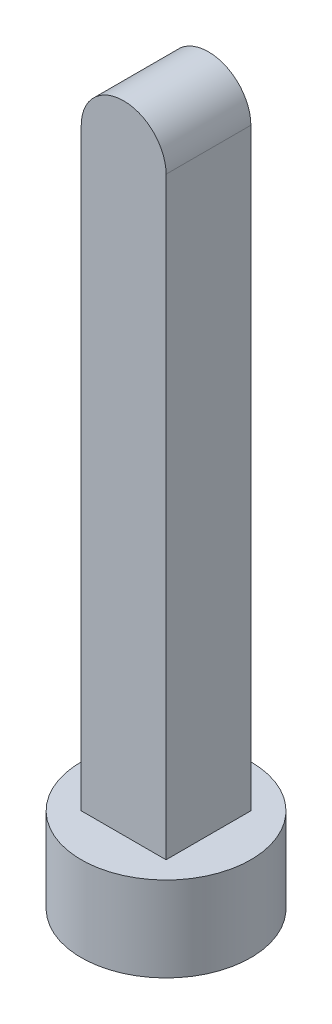
ISO-10303-21;
HEADER;
FILE_DESCRIPTION(('STEP AP214'),'2;1');
FILE_NAME('part.step','',(''),(''),'','','');
FILE_SCHEMA(('AUTOMOTIVE_DESIGN { 1 0 10303 214 1 1 1 1 }'));
ENDSEC;
DATA;
#1=APPLICATION_CONTEXT('core data for automotive mechanical design processes');
#2=APPLICATION_PROTOCOL_DEFINITION('international standard','automotive_design',2000,#1);
#3=PRODUCT_CONTEXT('',#1,'mechanical');
#4=PRODUCT('Part','Part','',(#3));
#5=PRODUCT_RELATED_PRODUCT_CATEGORY('part','',(#4));
#6=PRODUCT_DEFINITION_FORMATION('','',#4);
#7=PRODUCT_DEFINITION_CONTEXT('part definition',#1,'design');
#8=PRODUCT_DEFINITION('design','',#6,#7);
#9=PRODUCT_DEFINITION_SHAPE('','',#8);
#10=(LENGTH_UNIT() NAMED_UNIT(*) SI_UNIT(.MILLI.,.METRE.));
#11=(NAMED_UNIT(*) PLANE_ANGLE_UNIT() SI_UNIT($,.RADIAN.));
#12=(NAMED_UNIT(*) SI_UNIT($,.STERADIAN.) SOLID_ANGLE_UNIT());
#13=UNCERTAINTY_MEASURE_WITH_UNIT(LENGTH_MEASURE(1.E-05),#10,'distance_accuracy_value','');
#14=(GEOMETRIC_REPRESENTATION_CONTEXT(3) GLOBAL_UNCERTAINTY_ASSIGNED_CONTEXT((#13)) GLOBAL_UNIT_ASSIGNED_CONTEXT((#10,
#11,#12)) REPRESENTATION_CONTEXT('',''));
#15=CARTESIAN_POINT('',(0.,0.,0.));
#16=DIRECTION('',(0.,0.,1.));
#17=DIRECTION('',(1.,0.,0.));
#18=AXIS2_PLACEMENT_3D('',#15,#16,#17);
#19=CARTESIAN_POINT('',(-12.5,200.,-12.5));
#20=DIRECTION('',(1.,0.,0.));
#21=DIRECTION('',(0.,0.,-1.));
#22=AXIS2_PLACEMENT_3D('',#19,#20,#21);
#23=PLANE('',#22);
#24=DIRECTION('',(0.,0.,-1.));
#25=VECTOR('',#24,1.);
#26=CARTESIAN_POINT('',(-12.5,25.,-12.5));
#27=LINE('',#26,#25);
#28=CARTESIAN_POINT('',(-12.5,25.,12.5));
#29=VERTEX_POINT('',#28);
#30=CARTESIAN_POINT('',(-12.5,25.,-12.5));
#31=VERTEX_POINT('',#30);
#32=EDGE_CURVE('E54',#29,#31,#27,.T.);
#33=ORIENTED_EDGE('',*,*,#32,.F.);
#34=DIRECTION('',(0.,-1.,0.));
#35=VECTOR('',#34,1.);
#36=CARTESIAN_POINT('',(-12.5,200.,12.5));
#37=LINE('',#36,#35);
#38=CARTESIAN_POINT('',(-12.5,200.,12.5));
#39=VERTEX_POINT('',#38);
#40=EDGE_CURVE('E47',#39,#29,#37,.T.);
#41=ORIENTED_EDGE('',*,*,#40,.F.);
#42=DIRECTION('',(0.,0.,1.));
#43=VECTOR('',#42,1.);
#44=CARTESIAN_POINT('',(-12.5,200.,-12.5));
#45=LINE('',#44,#43);
#46=CARTESIAN_POINT('',(-12.5,200.,-12.5));
#47=VERTEX_POINT('',#46);
#48=EDGE_CURVE('E110',#47,#39,#45,.T.);
#49=ORIENTED_EDGE('',*,*,#48,.F.);
#50=DIRECTION('',(0.,-1.,0.));
#51=VECTOR('',#50,1.);
#52=CARTESIAN_POINT('',(-12.5,200.,-12.5));
#53=LINE('',#52,#51);
#54=EDGE_CURVE('E90',#47,#31,#53,.T.);
#55=ORIENTED_EDGE('',*,*,#54,.T.);
#56=EDGE_LOOP('',(#33,#41,#49,#55));
#57=FACE_BOUND('',#56,.T.);
#58=ADVANCED_FACE('F39',(#57),#23,.F.);
#59=CARTESIAN_POINT('',(-12.5,200.,12.5));
#60=DIRECTION('',(0.,0.,-1.));
#61=DIRECTION('',(-1.,0.,0.));
#62=AXIS2_PLACEMENT_3D('',#59,#60,#61);
#63=PLANE('',#62);
#64=DIRECTION('',(-1.,0.,0.));
#65=VECTOR('',#64,1.);
#66=CARTESIAN_POINT('',(-12.5,25.,12.5));
#67=LINE('',#66,#65);
#68=CARTESIAN_POINT('',(12.5,25.,12.5));
#69=VERTEX_POINT('',#68);
#70=EDGE_CURVE('E61',#69,#29,#67,.T.);
#71=ORIENTED_EDGE('',*,*,#70,.F.);
#72=DIRECTION('',(0.,-1.,0.));
#73=VECTOR('',#72,1.);
#74=CARTESIAN_POINT('',(12.5,200.,12.5));
#75=LINE('',#74,#73);
#76=CARTESIAN_POINT('',(12.5,200.,12.5));
#77=VERTEX_POINT('',#76);
#78=EDGE_CURVE('E89',#77,#69,#75,.T.);
#79=ORIENTED_EDGE('',*,*,#78,.F.);
#80=CARTESIAN_POINT('',(0.,200.,12.5));
#81=DIRECTION('',(0.,0.,1.));
#82=DIRECTION('',(-1.,0.,0.));
#83=AXIS2_PLACEMENT_3D('',#80,#81,#82);
#84=CIRCLE('',#83,12.5);
#85=EDGE_CURVE('E101',#77,#39,#84,.T.);
#86=ORIENTED_EDGE('',*,*,#85,.T.);
#87=ORIENTED_EDGE('',*,*,#40,.T.);
#88=EDGE_LOOP('',(#71,#79,#86,#87));
#89=FACE_BOUND('',#88,.T.);
#90=ADVANCED_FACE('F122',(#89),#63,.F.);
#91=CARTESIAN_POINT('',(12.5,200.,-12.5));
#92=DIRECTION('',(-1.,0.,0.));
#93=DIRECTION('',(0.,0.,1.));
#94=AXIS2_PLACEMENT_3D('',#91,#92,#93);
#95=PLANE('',#94);
#96=DIRECTION('',(0.,0.,1.));
#97=VECTOR('',#96,1.);
#98=CARTESIAN_POINT('',(12.5,25.,-12.5));
#99=LINE('',#98,#97);
#100=CARTESIAN_POINT('',(12.5,25.,-12.5));
#101=VERTEX_POINT('',#100);
#102=EDGE_CURVE('E93',#101,#69,#99,.T.);
#103=ORIENTED_EDGE('',*,*,#102,.F.);
#104=DIRECTION('',(0.,-1.,0.));
#105=VECTOR('',#104,1.);
#106=CARTESIAN_POINT('',(12.5,200.,-12.5));
#107=LINE('',#106,#105);
#108=CARTESIAN_POINT('',(12.5,200.,-12.5));
#109=VERTEX_POINT('',#108);
#110=EDGE_CURVE('E81',#109,#101,#107,.T.);
#111=ORIENTED_EDGE('',*,*,#110,.F.);
#112=DIRECTION('',(0.,0.,-1.));
#113=VECTOR('',#112,1.);
#114=CARTESIAN_POINT('',(12.5,200.,-12.5));
#115=LINE('',#114,#113);
#116=EDGE_CURVE('E115',#77,#109,#115,.T.);
#117=ORIENTED_EDGE('',*,*,#116,.F.);
#118=ORIENTED_EDGE('',*,*,#78,.T.);
#119=EDGE_LOOP('',(#103,#111,#117,#118));
#120=FACE_BOUND('',#119,.T.);
#121=ADVANCED_FACE('F94',(#120),#95,.F.);
#122=CARTESIAN_POINT('',(-12.5,200.,-12.5));
#123=DIRECTION('',(0.,0.,1.));
#124=DIRECTION('',(1.,0.,0.));
#125=AXIS2_PLACEMENT_3D('',#122,#123,#124);
#126=PLANE('',#125);
#127=DIRECTION('',(1.,0.,0.));
#128=VECTOR('',#127,1.);
#129=CARTESIAN_POINT('',(-12.5,25.,-12.5));
#130=LINE('',#129,#128);
#131=EDGE_CURVE('E11',#31,#101,#130,.T.);
#132=ORIENTED_EDGE('',*,*,#131,.F.);
#133=ORIENTED_EDGE('',*,*,#54,.F.);
#134=CARTESIAN_POINT('',(0.,200.,-12.5));
#135=DIRECTION('',(0.,0.,1.));
#136=DIRECTION('',(-1.,0.,0.));
#137=AXIS2_PLACEMENT_3D('',#134,#135,#136);
#138=CIRCLE('',#137,12.5);
#139=EDGE_CURVE('E85',#109,#47,#138,.T.);
#140=ORIENTED_EDGE('',*,*,#139,.F.);
#141=ORIENTED_EDGE('',*,*,#110,.T.);
#142=EDGE_LOOP('',(#132,#133,#140,#141));
#143=FACE_BOUND('',#142,.T.);
#144=ADVANCED_FACE('F83',(#143),#126,.F.);
#145=CARTESIAN_POINT('',(0.,200.,-12.5));
#146=DIRECTION('',(0.,0.,1.));
#147=DIRECTION('',(1.,0.,0.));
#148=AXIS2_PLACEMENT_3D('',#145,#146,#147);
#149=CYLINDRICAL_SURFACE('',#148,12.5);
#150=ORIENTED_EDGE('',*,*,#85,.F.);
#151=ORIENTED_EDGE('',*,*,#116,.T.);
#152=ORIENTED_EDGE('',*,*,#139,.T.);
#153=ORIENTED_EDGE('',*,*,#48,.T.);
#154=EDGE_LOOP('',(#150,#151,#152,#153));
#155=FACE_BOUND('',#154,.T.);
#156=ADVANCED_FACE('F126',(#155),#149,.T.);
#157=CARTESIAN_POINT('',(0.,25.,0.));
#158=DIRECTION('',(0.,-1.,0.));
#159=DIRECTION('',(0.,0.,-1.));
#160=AXIS2_PLACEMENT_3D('',#157,#158,#159);
#161=PLANE('',#160);
#162=CARTESIAN_POINT('',(0.,25.,0.));
#163=DIRECTION('',(0.,-1.,0.));
#164=DIRECTION('',(0.,0.,-1.));
#165=AXIS2_PLACEMENT_3D('',#162,#163,#164);
#166=CIRCLE('',#165,25.);
#167=CARTESIAN_POINT('',(0.,25.,-25.));
#168=VERTEX_POINT('',#167);
#169=EDGE_CURVE('E97',#168,#168,#166,.T.);
#170=ORIENTED_EDGE('',*,*,#169,.F.);
#171=EDGE_LOOP('',(#170));
#172=FACE_BOUND('',#171,.T.);
#173=ORIENTED_EDGE('',*,*,#70,.T.);
#174=ORIENTED_EDGE('',*,*,#32,.T.);
#175=ORIENTED_EDGE('',*,*,#131,.T.);
#176=ORIENTED_EDGE('',*,*,#102,.T.);
#177=EDGE_LOOP('',(#173,#174,#175,#176));
#178=FACE_BOUND('',#177,.T.);
#179=ADVANCED_FACE('F99',(#172,#178),#161,.F.);
#180=CARTESIAN_POINT('',(0.,25.,0.));
#181=DIRECTION('',(0.,-1.,0.));
#182=DIRECTION('',(0.,0.,-1.));
#183=AXIS2_PLACEMENT_3D('',#180,#181,#182);
#184=CYLINDRICAL_SURFACE('',#183,25.);
#185=ORIENTED_EDGE('',*,*,#169,.T.);
#186=EDGE_LOOP('',(#185));
#187=FACE_BOUND('',#186,.T.);
#188=CARTESIAN_POINT('',(0.,0.,0.));
#189=DIRECTION('',(0.,-1.,0.));
#190=DIRECTION('',(0.,0.,-1.));
#191=AXIS2_PLACEMENT_3D('',#188,#189,#190);
#192=CIRCLE('',#191,25.);
#193=CARTESIAN_POINT('',(0.,0.,-25.));
#194=VERTEX_POINT('',#193);
#195=EDGE_CURVE('E156',#194,#194,#192,.T.);
#196=ORIENTED_EDGE('',*,*,#195,.F.);
#197=EDGE_LOOP('',(#196));
#198=FACE_BOUND('',#197,.T.);
#199=ADVANCED_FACE('F133',(#187,#198),#184,.T.);
#200=CARTESIAN_POINT('',(0.,0.,0.));
#201=DIRECTION('',(0.,1.,0.));
#202=DIRECTION('',(0.,0.,1.));
#203=AXIS2_PLACEMENT_3D('',#200,#201,#202);
#204=PLANE('',#203);
#205=ORIENTED_EDGE('',*,*,#195,.T.);
#206=EDGE_LOOP('',(#205));
#207=FACE_BOUND('',#206,.T.);
#208=ADVANCED_FACE('F147',(#207),#204,.F.);
#209=CLOSED_SHELL('',(#58,#90,#121,#144,#156,#179,#199,#208));
#210=MANIFOLD_SOLID_BREP('B2',#209);
#211=ADVANCED_BREP_SHAPE_REPRESENTATION('',(#18,#210),#14);
#212=SHAPE_DEFINITION_REPRESENTATION(#9,#211);
ENDSEC;
END-ISO-10303-21;
